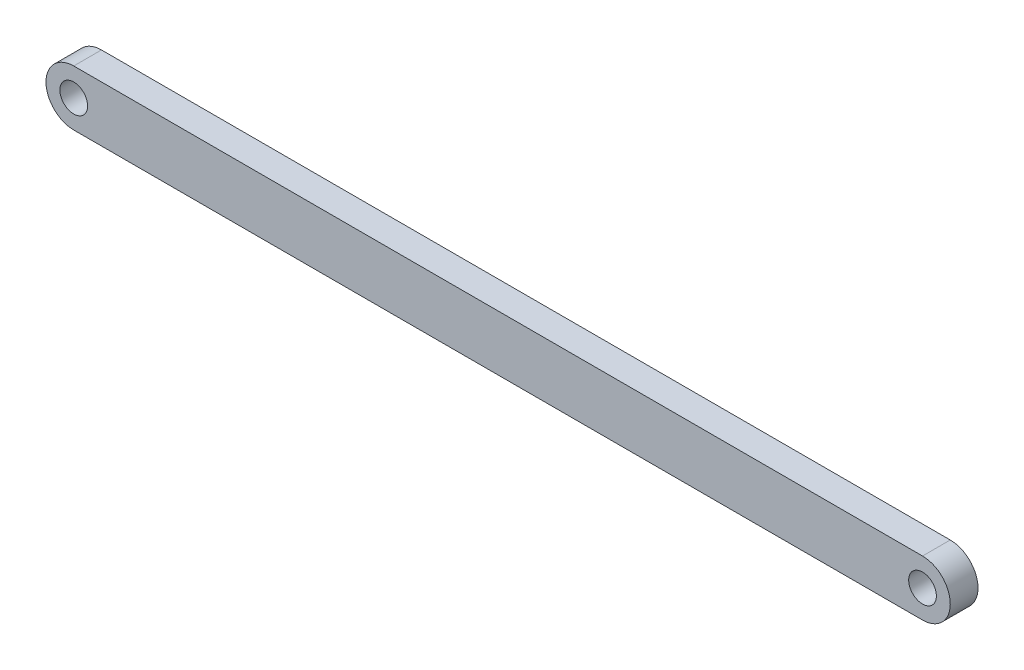
ISO-10303-21;
HEADER;
FILE_DESCRIPTION(('STEP AP214'),'2;1');
FILE_NAME('part.step','',(''),(''),'','','');
FILE_SCHEMA(('AUTOMOTIVE_DESIGN { 1 0 10303 214 1 1 1 1 }'));
ENDSEC;
DATA;
#1=APPLICATION_CONTEXT('core data for automotive mechanical design processes');
#2=APPLICATION_PROTOCOL_DEFINITION('international standard','automotive_design',2000,#1);
#3=PRODUCT_CONTEXT('',#1,'mechanical');
#4=PRODUCT('Part','Part','',(#3));
#5=PRODUCT_RELATED_PRODUCT_CATEGORY('part','',(#4));
#6=PRODUCT_DEFINITION_FORMATION('','',#4);
#7=PRODUCT_DEFINITION_CONTEXT('part definition',#1,'design');
#8=PRODUCT_DEFINITION('design','',#6,#7);
#9=PRODUCT_DEFINITION_SHAPE('','',#8);
#10=(LENGTH_UNIT() NAMED_UNIT(*) SI_UNIT(.MILLI.,.METRE.));
#11=(NAMED_UNIT(*) PLANE_ANGLE_UNIT() SI_UNIT($,.RADIAN.));
#12=(NAMED_UNIT(*) SI_UNIT($,.STERADIAN.) SOLID_ANGLE_UNIT());
#13=UNCERTAINTY_MEASURE_WITH_UNIT(LENGTH_MEASURE(1.E-05),#10,'distance_accuracy_value','');
#14=(GEOMETRIC_REPRESENTATION_CONTEXT(3) GLOBAL_UNCERTAINTY_ASSIGNED_CONTEXT((#13)) GLOBAL_UNIT_ASSIGNED_CONTEXT((#10,
#11,#12)) REPRESENTATION_CONTEXT('',''));
#15=CARTESIAN_POINT('',(0.,0.,0.));
#16=DIRECTION('',(0.,0.,1.));
#17=DIRECTION('',(1.,0.,0.));
#18=AXIS2_PLACEMENT_3D('',#15,#16,#17);
#19=CARTESIAN_POINT('',(0.,0.,10.));
#20=DIRECTION('',(0.,0.,1.));
#21=DIRECTION('',(1.,0.,0.));
#22=AXIS2_PLACEMENT_3D('',#19,#20,#21);
#23=PLANE('',#22);
#24=CARTESIAN_POINT('',(0.,0.,10.));
#25=DIRECTION('',(0.,0.,1.));
#26=DIRECTION('',(1.,0.,0.));
#27=AXIS2_PLACEMENT_3D('',#24,#25,#26);
#28=CIRCLE('',#27,5.);
#29=CARTESIAN_POINT('',(5.,0.,10.));
#30=VERTEX_POINT('',#29);
#31=EDGE_CURVE('E101',#30,#30,#28,.T.);
#32=ORIENTED_EDGE('',*,*,#31,.F.);
#33=EDGE_LOOP('',(#32));
#34=FACE_BOUND('',#33,.T.);
#35=CARTESIAN_POINT('',(0.,0.,10.));
#36=DIRECTION('',(0.,0.,1.));
#37=DIRECTION('',(1.,0.,0.));
#38=AXIS2_PLACEMENT_3D('',#35,#36,#37);
#39=CIRCLE('',#38,10.);
#40=CARTESIAN_POINT('',(0.,10.,10.));
#41=VERTEX_POINT('',#40);
#42=CARTESIAN_POINT('',(0.,-10.,10.));
#43=VERTEX_POINT('',#42);
#44=EDGE_CURVE('E86',#41,#43,#39,.T.);
#45=ORIENTED_EDGE('',*,*,#44,.T.);
#46=DIRECTION('',(1.,0.,0.));
#47=VECTOR('',#46,1.);
#48=CARTESIAN_POINT('',(0.,-10.,10.));
#49=LINE('',#48,#47);
#50=CARTESIAN_POINT('',(306.,-10.,10.));
#51=VERTEX_POINT('',#50);
#52=EDGE_CURVE('E81',#43,#51,#49,.T.);
#53=ORIENTED_EDGE('',*,*,#52,.T.);
#54=CARTESIAN_POINT('',(306.,0.,10.));
#55=DIRECTION('',(0.,0.,1.));
#56=DIRECTION('',(1.,0.,0.));
#57=AXIS2_PLACEMENT_3D('',#54,#55,#56);
#58=CIRCLE('',#57,10.);
#59=CARTESIAN_POINT('',(306.,10.,10.));
#60=VERTEX_POINT('',#59);
#61=EDGE_CURVE('E84',#51,#60,#58,.T.);
#62=ORIENTED_EDGE('',*,*,#61,.T.);
#63=DIRECTION('',(-1.,0.,0.));
#64=VECTOR('',#63,1.);
#65=CARTESIAN_POINT('',(0.,10.,10.));
#66=LINE('',#65,#64);
#67=EDGE_CURVE('E51',#60,#41,#66,.T.);
#68=ORIENTED_EDGE('',*,*,#67,.T.);
#69=EDGE_LOOP('',(#45,#53,#62,#68));
#70=FACE_BOUND('',#69,.T.);
#71=CARTESIAN_POINT('',(306.,0.,10.));
#72=DIRECTION('',(0.,0.,1.));
#73=DIRECTION('',(1.,0.,0.));
#74=AXIS2_PLACEMENT_3D('',#71,#72,#73);
#75=CIRCLE('',#74,4.99999999999999);
#76=CARTESIAN_POINT('',(311.,0.,10.));
#77=VERTEX_POINT('',#76);
#78=EDGE_CURVE('E116',#77,#77,#75,.T.);
#79=ORIENTED_EDGE('',*,*,#78,.F.);
#80=EDGE_LOOP('',(#79));
#81=FACE_BOUND('',#80,.T.);
#82=ADVANCED_FACE('F34',(#34,#70,#81),#23,.T.);
#83=CARTESIAN_POINT('',(0.,0.,0.));
#84=DIRECTION('',(0.,0.,1.));
#85=DIRECTION('',(1.,0.,0.));
#86=AXIS2_PLACEMENT_3D('',#83,#84,#85);
#87=PLANE('',#86);
#88=CARTESIAN_POINT('',(0.,0.,0.));
#89=DIRECTION('',(0.,0.,1.));
#90=DIRECTION('',(1.,0.,0.));
#91=AXIS2_PLACEMENT_3D('',#88,#89,#90);
#92=CIRCLE('',#91,10.);
#93=CARTESIAN_POINT('',(0.,10.,0.));
#94=VERTEX_POINT('',#93);
#95=CARTESIAN_POINT('',(0.,-10.,0.));
#96=VERTEX_POINT('',#95);
#97=EDGE_CURVE('E98',#94,#96,#92,.T.);
#98=ORIENTED_EDGE('',*,*,#97,.F.);
#99=DIRECTION('',(-1.,0.,0.));
#100=VECTOR('',#99,1.);
#101=CARTESIAN_POINT('',(0.,10.,0.));
#102=LINE('',#101,#100);
#103=CARTESIAN_POINT('',(306.,10.,0.));
#104=VERTEX_POINT('',#103);
#105=EDGE_CURVE('E74',#104,#94,#102,.T.);
#106=ORIENTED_EDGE('',*,*,#105,.F.);
#107=CARTESIAN_POINT('',(306.,0.,0.));
#108=DIRECTION('',(0.,0.,1.));
#109=DIRECTION('',(1.,0.,0.));
#110=AXIS2_PLACEMENT_3D('',#107,#108,#109);
#111=CIRCLE('',#110,10.);
#112=CARTESIAN_POINT('',(306.,-10.,0.));
#113=VERTEX_POINT('',#112);
#114=EDGE_CURVE('E68',#113,#104,#111,.T.);
#115=ORIENTED_EDGE('',*,*,#114,.F.);
#116=DIRECTION('',(1.,0.,0.));
#117=VECTOR('',#116,1.);
#118=CARTESIAN_POINT('',(0.,-10.,0.));
#119=LINE('',#118,#117);
#120=EDGE_CURVE('E90',#96,#113,#119,.T.);
#121=ORIENTED_EDGE('',*,*,#120,.F.);
#122=EDGE_LOOP('',(#98,#106,#115,#121));
#123=FACE_BOUND('',#122,.T.);
#124=CARTESIAN_POINT('',(0.,0.,0.));
#125=DIRECTION('',(0.,0.,1.));
#126=DIRECTION('',(1.,0.,0.));
#127=AXIS2_PLACEMENT_3D('',#124,#125,#126);
#128=CIRCLE('',#127,5.);
#129=CARTESIAN_POINT('',(5.,0.,0.));
#130=VERTEX_POINT('',#129);
#131=EDGE_CURVE('E113',#130,#130,#128,.T.);
#132=ORIENTED_EDGE('',*,*,#131,.T.);
#133=EDGE_LOOP('',(#132));
#134=FACE_BOUND('',#133,.T.);
#135=CARTESIAN_POINT('',(306.,0.,0.));
#136=DIRECTION('',(0.,0.,1.));
#137=DIRECTION('',(1.,0.,0.));
#138=AXIS2_PLACEMENT_3D('',#135,#136,#137);
#139=CIRCLE('',#138,4.99999999999999);
#140=CARTESIAN_POINT('',(311.,0.,0.));
#141=VERTEX_POINT('',#140);
#142=EDGE_CURVE('E119',#141,#141,#139,.T.);
#143=ORIENTED_EDGE('',*,*,#142,.T.);
#144=EDGE_LOOP('',(#143));
#145=FACE_BOUND('',#144,.T.);
#146=ADVANCED_FACE('F109',(#123,#134,#145),#87,.F.);
#147=CARTESIAN_POINT('',(0.,0.,10.));
#148=DIRECTION('',(0.,0.,-1.));
#149=DIRECTION('',(-1.,0.,0.));
#150=AXIS2_PLACEMENT_3D('',#147,#148,#149);
#151=CYLINDRICAL_SURFACE('',#150,10.);
#152=ORIENTED_EDGE('',*,*,#97,.T.);
#153=DIRECTION('',(0.,0.,-1.));
#154=VECTOR('',#153,1.);
#155=CARTESIAN_POINT('',(0.,-10.,10.));
#156=LINE('',#155,#154);
#157=EDGE_CURVE('E11',#43,#96,#156,.T.);
#158=ORIENTED_EDGE('',*,*,#157,.F.);
#159=ORIENTED_EDGE('',*,*,#44,.F.);
#160=DIRECTION('',(0.,0.,-1.));
#161=VECTOR('',#160,1.);
#162=CARTESIAN_POINT('',(0.,10.,10.));
#163=LINE('',#162,#161);
#164=EDGE_CURVE('E94',#41,#94,#163,.T.);
#165=ORIENTED_EDGE('',*,*,#164,.T.);
#166=EDGE_LOOP('',(#152,#158,#159,#165));
#167=FACE_BOUND('',#166,.T.);
#168=ADVANCED_FACE('F36',(#167),#151,.T.);
#169=CARTESIAN_POINT('',(0.,-10.,10.));
#170=DIRECTION('',(0.,1.,0.));
#171=DIRECTION('',(0.,0.,1.));
#172=AXIS2_PLACEMENT_3D('',#169,#170,#171);
#173=PLANE('',#172);
#174=ORIENTED_EDGE('',*,*,#120,.T.);
#175=DIRECTION('',(0.,0.,-1.));
#176=VECTOR('',#175,1.);
#177=CARTESIAN_POINT('',(306.,-10.,10.));
#178=LINE('',#177,#176);
#179=EDGE_CURVE('E43',#51,#113,#178,.T.);
#180=ORIENTED_EDGE('',*,*,#179,.F.);
#181=ORIENTED_EDGE('',*,*,#52,.F.);
#182=ORIENTED_EDGE('',*,*,#157,.T.);
#183=EDGE_LOOP('',(#174,#180,#181,#182));
#184=FACE_BOUND('',#183,.T.);
#185=ADVANCED_FACE('F89',(#184),#173,.F.);
#186=CARTESIAN_POINT('',(306.,0.,10.));
#187=DIRECTION('',(0.,0.,-1.));
#188=DIRECTION('',(-1.,0.,0.));
#189=AXIS2_PLACEMENT_3D('',#186,#187,#188);
#190=CYLINDRICAL_SURFACE('',#189,10.);
#191=ORIENTED_EDGE('',*,*,#114,.T.);
#192=DIRECTION('',(0.,0.,-1.));
#193=VECTOR('',#192,1.);
#194=CARTESIAN_POINT('',(306.,10.,10.));
#195=LINE('',#194,#193);
#196=EDGE_CURVE('E91',#60,#104,#195,.T.);
#197=ORIENTED_EDGE('',*,*,#196,.F.);
#198=ORIENTED_EDGE('',*,*,#61,.F.);
#199=ORIENTED_EDGE('',*,*,#179,.T.);
#200=EDGE_LOOP('',(#191,#197,#198,#199));
#201=FACE_BOUND('',#200,.T.);
#202=ADVANCED_FACE('F92',(#201),#190,.T.);
#203=CARTESIAN_POINT('',(0.,10.,10.));
#204=DIRECTION('',(0.,-1.,0.));
#205=DIRECTION('',(0.,0.,-1.));
#206=AXIS2_PLACEMENT_3D('',#203,#204,#205);
#207=PLANE('',#206);
#208=ORIENTED_EDGE('',*,*,#105,.T.);
#209=ORIENTED_EDGE('',*,*,#164,.F.);
#210=ORIENTED_EDGE('',*,*,#67,.F.);
#211=ORIENTED_EDGE('',*,*,#196,.T.);
#212=EDGE_LOOP('',(#208,#209,#210,#211));
#213=FACE_BOUND('',#212,.T.);
#214=ADVANCED_FACE('F106',(#213),#207,.F.);
#215=CARTESIAN_POINT('',(0.,0.,10.));
#216=DIRECTION('',(0.,0.,-1.));
#217=DIRECTION('',(-1.,0.,0.));
#218=AXIS2_PLACEMENT_3D('',#215,#216,#217);
#219=CYLINDRICAL_SURFACE('',#218,5.);
#220=ORIENTED_EDGE('',*,*,#31,.T.);
#221=EDGE_LOOP('',(#220));
#222=FACE_BOUND('',#221,.T.);
#223=ORIENTED_EDGE('',*,*,#131,.F.);
#224=EDGE_LOOP('',(#223));
#225=FACE_BOUND('',#224,.T.);
#226=ADVANCED_FACE('F136',(#222,#225),#219,.F.);
#227=CARTESIAN_POINT('',(306.,0.,10.));
#228=DIRECTION('',(0.,0.,-1.));
#229=DIRECTION('',(-1.,0.,0.));
#230=AXIS2_PLACEMENT_3D('',#227,#228,#229);
#231=CYLINDRICAL_SURFACE('',#230,4.99999999999999);
#232=ORIENTED_EDGE('',*,*,#78,.T.);
#233=EDGE_LOOP('',(#232));
#234=FACE_BOUND('',#233,.T.);
#235=ORIENTED_EDGE('',*,*,#142,.F.);
#236=EDGE_LOOP('',(#235));
#237=FACE_BOUND('',#236,.T.);
#238=ADVANCED_FACE('F125',(#234,#237),#231,.F.);
#239=CLOSED_SHELL('',(#82,#146,#168,#185,#202,#214,#226,#238));
#240=MANIFOLD_SOLID_BREP('B2',#239);
#241=ADVANCED_BREP_SHAPE_REPRESENTATION('',(#18,#240),#14);
#242=SHAPE_DEFINITION_REPRESENTATION(#9,#241);
ENDSEC;
END-ISO-10303-21;
